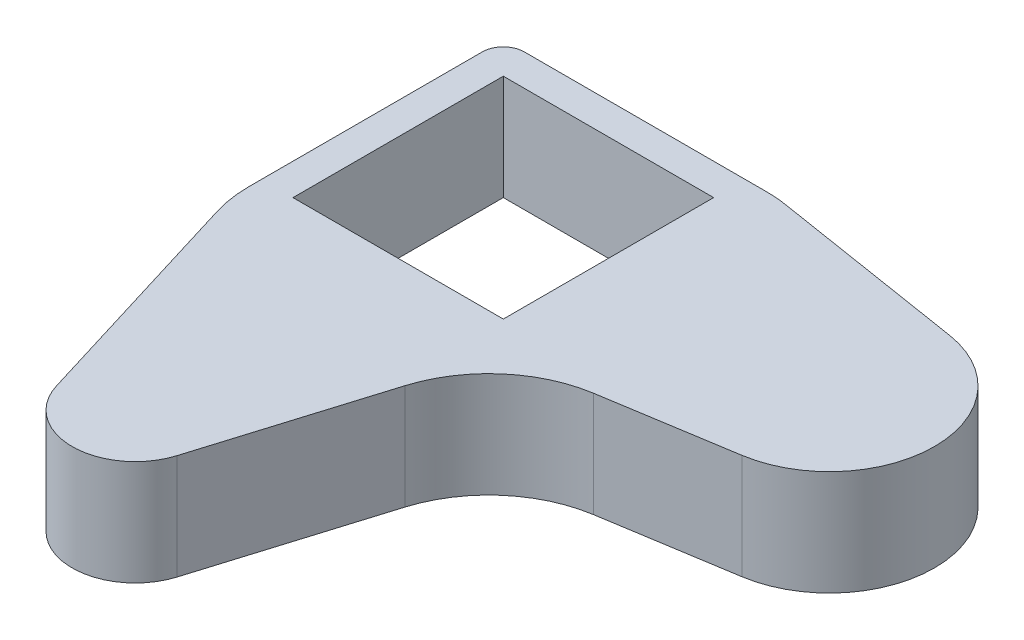
ISO-10303-21;
HEADER;
FILE_DESCRIPTION(('STEP AP214'),'2;1');
FILE_NAME('part.step','',(''),(''),'','','');
FILE_SCHEMA(('AUTOMOTIVE_DESIGN { 1 0 10303 214 1 1 1 1 }'));
ENDSEC;
DATA;
#1=APPLICATION_CONTEXT('core data for automotive mechanical design processes');
#2=APPLICATION_PROTOCOL_DEFINITION('international standard','automotive_design',2000,#1);
#3=PRODUCT_CONTEXT('',#1,'mechanical');
#4=PRODUCT('Part','Part','',(#3));
#5=PRODUCT_RELATED_PRODUCT_CATEGORY('part','',(#4));
#6=PRODUCT_DEFINITION_FORMATION('','',#4);
#7=PRODUCT_DEFINITION_CONTEXT('part definition',#1,'design');
#8=PRODUCT_DEFINITION('design','',#6,#7);
#9=PRODUCT_DEFINITION_SHAPE('','',#8);
#10=(LENGTH_UNIT() NAMED_UNIT(*) SI_UNIT(.MILLI.,.METRE.));
#11=(NAMED_UNIT(*) PLANE_ANGLE_UNIT() SI_UNIT($,.RADIAN.));
#12=(NAMED_UNIT(*) SI_UNIT($,.STERADIAN.) SOLID_ANGLE_UNIT());
#13=UNCERTAINTY_MEASURE_WITH_UNIT(LENGTH_MEASURE(1.E-05),#10,'distance_accuracy_value','');
#14=(GEOMETRIC_REPRESENTATION_CONTEXT(3) GLOBAL_UNCERTAINTY_ASSIGNED_CONTEXT((#13)) GLOBAL_UNIT_ASSIGNED_CONTEXT((#10,
#11,#12)) REPRESENTATION_CONTEXT('',''));
#15=CARTESIAN_POINT('',(0.,0.,0.));
#16=DIRECTION('',(0.,0.,1.));
#17=DIRECTION('',(1.,0.,0.));
#18=AXIS2_PLACEMENT_3D('',#15,#16,#17);
#19=CARTESIAN_POINT('',(-1.,10.,-1.));
#20=DIRECTION('',(0.,-1.,0.));
#21=DIRECTION('',(0.,0.,-1.));
#22=AXIS2_PLACEMENT_3D('',#19,#20,#21);
#23=PLANE('',#22);
#24=CARTESIAN_POINT('',(-1.,10.,-1.));
#25=DIRECTION('',(0.,1.,0.));
#26=DIRECTION('',(0.,0.,-1.));
#27=AXIS2_PLACEMENT_3D('',#24,#25,#26);
#28=CIRCLE('',#27,2.);
#29=CARTESIAN_POINT('',(-1.,10.,-3.));
#30=VERTEX_POINT('',#29);
#31=CARTESIAN_POINT('',(-3.,10.,-1.));
#32=VERTEX_POINT('',#31);
#33=EDGE_CURVE('E207',#30,#32,#28,.T.);
#34=ORIENTED_EDGE('',*,*,#33,.T.);
#35=DIRECTION('',(0.,0.,1.));
#36=VECTOR('',#35,1.);
#37=CARTESIAN_POINT('',(-3.,10.,21.2066412441588));
#38=LINE('',#37,#36);
#39=CARTESIAN_POINT('',(-3.,10.,21.2066412441588));
#40=VERTEX_POINT('',#39);
#41=EDGE_CURVE('E211',#32,#40,#38,.T.);
#42=ORIENTED_EDGE('',*,*,#41,.T.);
#43=CARTESIAN_POINT('',(9.,10.,21.2066412441589));
#44=DIRECTION('',(0.,1.,0.));
#45=DIRECTION('',(0.,0.,1.));
#46=AXIS2_PLACEMENT_3D('',#43,#44,#45);
#47=CIRCLE('',#46,12.);
#48=CARTESIAN_POINT('',(-2.47568753436689,10.,24.7150020599212));
#49=VERTEX_POINT('',#48);
#50=EDGE_CURVE('E215',#40,#49,#47,.T.);
#51=ORIENTED_EDGE('',*,*,#50,.T.);
#52=DIRECTION('',(0.292363401313522,0.,0.956307294530575));
#53=VECTOR('',#52,1.);
#54=CARTESIAN_POINT('',(-2.47568753436689,10.,24.7150020599212));
#55=LINE('',#54,#53);
#56=CARTESIAN_POINT('',(4.26215623281655,10.,46.7541804078811));
#57=VERTEX_POINT('',#56);
#58=EDGE_CURVE('E218',#49,#57,#55,.T.);
#59=ORIENTED_EDGE('',*,*,#58,.T.);
#60=CARTESIAN_POINT('',(10.,10.,45.));
#61=DIRECTION('',(0.,1.,0.));
#62=DIRECTION('',(0.,0.,1.));
#63=AXIS2_PLACEMENT_3D('',#60,#61,#62);
#64=CIRCLE('',#63,6.00000000000001);
#65=CARTESIAN_POINT('',(15.7378437671835,10.,46.7541804078811));
#66=VERTEX_POINT('',#65);
#67=EDGE_CURVE('E221',#57,#66,#64,.T.);
#68=ORIENTED_EDGE('',*,*,#67,.T.);
#69=DIRECTION('',(0.292363401313521,0.,-0.956307294530575));
#70=VECTOR('',#69,1.);
#71=CARTESIAN_POINT('',(20.8106801247672,10.,30.1611650341308));
#72=LINE('',#71,#70);
#73=CARTESIAN_POINT('',(20.8106801247672,10.,30.1611650341308));
#74=VERTEX_POINT('',#73);
#75=EDGE_CURVE('E224',#66,#74,#72,.T.);
#76=ORIENTED_EDGE('',*,*,#75,.T.);
#77=CARTESIAN_POINT('',(32.2863676591341,10.,33.669525849893));
#78=DIRECTION('',(0.,-1.,0.));
#79=DIRECTION('',(0.,0.,1.));
#80=AXIS2_PLACEMENT_3D('',#77,#78,#79);
#81=CIRCLE('',#80,12.);
#82=CARTESIAN_POINT('',(30.3947256594395,10.,21.819560004162));
#83=VERTEX_POINT('',#82);
#84=EDGE_CURVE('E227',#74,#83,#81,.T.);
#85=ORIENTED_EDGE('',*,*,#84,.T.);
#86=DIRECTION('',(0.987497153810917,0.,-0.157636833307885));
#87=VECTOR('',#86,1.);
#88=CARTESIAN_POINT('',(30.3947256594395,10.,21.819560004162));
#89=LINE('',#88,#87);
#90=CARTESIAN_POINT('',(42.5763683330788,10.,19.8749715381092));
#91=VERTEX_POINT('',#90);
#92=EDGE_CURVE('E230',#83,#91,#89,.T.);
#93=ORIENTED_EDGE('',*,*,#92,.T.);
#94=CARTESIAN_POINT('',(41.,10.,9.99999999999999));
#95=DIRECTION('',(0.,1.,0.));
#96=DIRECTION('',(0.,0.,1.));
#97=AXIS2_PLACEMENT_3D('',#94,#95,#96);
#98=CIRCLE('',#97,10.);
#99=CARTESIAN_POINT('',(42.5763683330788,10.,0.12502846189082));
#100=VERTEX_POINT('',#99);
#101=EDGE_CURVE('E233',#91,#100,#98,.T.);
#102=ORIENTED_EDGE('',*,*,#101,.T.);
#103=DIRECTION('',(-0.987497153810917,0.,-0.157636833307885));
#104=VECTOR('',#103,1.);
#105=CARTESIAN_POINT('',(23.9398710771213,10.,-2.849965845731));
#106=LINE('',#105,#104);
#107=CARTESIAN_POINT('',(23.9398710771213,10.,-2.849965845731));
#108=VERTEX_POINT('',#107);
#109=EDGE_CURVE('E236',#100,#108,#106,.T.);
#110=ORIENTED_EDGE('',*,*,#109,.T.);
#111=CARTESIAN_POINT('',(22.0482290774266,10.,9.));
#112=DIRECTION('',(0.,1.,0.));
#113=DIRECTION('',(0.,0.,1.));
#114=AXIS2_PLACEMENT_3D('',#111,#112,#113);
#115=CIRCLE('',#114,12.);
#116=CARTESIAN_POINT('',(22.0482290774266,10.,-3.));
#117=VERTEX_POINT('',#116);
#118=EDGE_CURVE('E239',#108,#117,#115,.T.);
#119=ORIENTED_EDGE('',*,*,#118,.T.);
#120=DIRECTION('',(-1.,0.,0.));
#121=VECTOR('',#120,1.);
#122=CARTESIAN_POINT('',(-1.,10.,-3.));
#123=LINE('',#122,#121);
#124=EDGE_CURVE('E242',#117,#30,#123,.T.);
#125=ORIENTED_EDGE('',*,*,#124,.T.);
#126=EDGE_LOOP('',(#34,#42,#51,#59,#68,#76,#85,#93,#102,#110,#119,#125));
#127=FACE_BOUND('',#126,.T.);
#128=DIRECTION('',(0.,0.,-1.));
#129=VECTOR('',#128,1.);
#130=CARTESIAN_POINT('',(20.,10.,20.));
#131=LINE('',#130,#129);
#132=CARTESIAN_POINT('',(20.,10.,20.));
#133=VERTEX_POINT('',#132);
#134=CARTESIAN_POINT('',(20.,10.,0.));
#135=VERTEX_POINT('',#134);
#136=EDGE_CURVE('E159',#133,#135,#131,.T.);
#137=ORIENTED_EDGE('',*,*,#136,.F.);
#138=DIRECTION('',(1.,0.,0.));
#139=VECTOR('',#138,1.);
#140=CARTESIAN_POINT('',(0.,10.,20.));
#141=LINE('',#140,#139);
#142=CARTESIAN_POINT('',(0.,10.,20.));
#143=VERTEX_POINT('',#142);
#144=EDGE_CURVE('E185',#143,#133,#141,.T.);
#145=ORIENTED_EDGE('',*,*,#144,.F.);
#146=DIRECTION('',(0.,0.,1.));
#147=VECTOR('',#146,1.);
#148=CARTESIAN_POINT('',(0.,10.,20.));
#149=LINE('',#148,#147);
#150=CARTESIAN_POINT('',(0.,10.,0.));
#151=VERTEX_POINT('',#150);
#152=EDGE_CURVE('E181',#151,#143,#149,.T.);
#153=ORIENTED_EDGE('',*,*,#152,.F.);
#154=DIRECTION('',(-1.,0.,0.));
#155=VECTOR('',#154,1.);
#156=CARTESIAN_POINT('',(0.,10.,0.));
#157=LINE('',#156,#155);
#158=EDGE_CURVE('E168',#135,#151,#157,.T.);
#159=ORIENTED_EDGE('',*,*,#158,.F.);
#160=EDGE_LOOP('',(#137,#145,#153,#159));
#161=FACE_BOUND('',#160,.T.);
#162=ADVANCED_FACE('F45',(#127,#161),#23,.F.);
#163=CARTESIAN_POINT('',(-1.,0.,-1.));
#164=DIRECTION('',(0.,-1.,0.));
#165=DIRECTION('',(0.,0.,-1.));
#166=AXIS2_PLACEMENT_3D('',#163,#164,#165);
#167=PLANE('',#166);
#168=CARTESIAN_POINT('',(-1.,0.,-1.));
#169=DIRECTION('',(0.,1.,0.));
#170=DIRECTION('',(0.,0.,-1.));
#171=AXIS2_PLACEMENT_3D('',#168,#169,#170);
#172=CIRCLE('',#171,2.);
#173=CARTESIAN_POINT('',(-1.,0.,-3.));
#174=VERTEX_POINT('',#173);
#175=CARTESIAN_POINT('',(-3.,0.,-1.));
#176=VERTEX_POINT('',#175);
#177=EDGE_CURVE('E177',#174,#176,#172,.T.);
#178=ORIENTED_EDGE('',*,*,#177,.F.);
#179=DIRECTION('',(-1.,0.,0.));
#180=VECTOR('',#179,1.);
#181=CARTESIAN_POINT('',(-1.,0.,-3.));
#182=LINE('',#181,#180);
#183=CARTESIAN_POINT('',(22.0482290774266,0.,-3.));
#184=VERTEX_POINT('',#183);
#185=EDGE_CURVE('E212',#184,#174,#182,.T.);
#186=ORIENTED_EDGE('',*,*,#185,.F.);
#187=CARTESIAN_POINT('',(22.0482290774266,0.,9.));
#188=DIRECTION('',(0.,1.,0.));
#189=DIRECTION('',(0.,0.,1.));
#190=AXIS2_PLACEMENT_3D('',#187,#188,#189);
#191=CIRCLE('',#190,12.);
#192=CARTESIAN_POINT('',(23.9398710771213,0.,-2.849965845731));
#193=VERTEX_POINT('',#192);
#194=EDGE_CURVE('E276',#193,#184,#191,.T.);
#195=ORIENTED_EDGE('',*,*,#194,.F.);
#196=DIRECTION('',(-0.987497153810917,0.,-0.157636833307885));
#197=VECTOR('',#196,1.);
#198=CARTESIAN_POINT('',(23.9398710771213,0.,-2.849965845731));
#199=LINE('',#198,#197);
#200=CARTESIAN_POINT('',(42.5763683330788,0.,0.12502846189082));
#201=VERTEX_POINT('',#200);
#202=EDGE_CURVE('E273',#201,#193,#199,.T.);
#203=ORIENTED_EDGE('',*,*,#202,.F.);
#204=CARTESIAN_POINT('',(41.,0.,9.99999999999999));
#205=DIRECTION('',(0.,1.,0.));
#206=DIRECTION('',(0.,0.,1.));
#207=AXIS2_PLACEMENT_3D('',#204,#205,#206);
#208=CIRCLE('',#207,10.);
#209=CARTESIAN_POINT('',(42.5763683330788,0.,19.8749715381092));
#210=VERTEX_POINT('',#209);
#211=EDGE_CURVE('E270',#210,#201,#208,.T.);
#212=ORIENTED_EDGE('',*,*,#211,.F.);
#213=DIRECTION('',(0.987497153810917,0.,-0.157636833307885));
#214=VECTOR('',#213,1.);
#215=CARTESIAN_POINT('',(30.3947256594395,0.,21.819560004162));
#216=LINE('',#215,#214);
#217=CARTESIAN_POINT('',(30.3947256594395,0.,21.819560004162));
#218=VERTEX_POINT('',#217);
#219=EDGE_CURVE('E267',#218,#210,#216,.T.);
#220=ORIENTED_EDGE('',*,*,#219,.F.);
#221=CARTESIAN_POINT('',(32.2863676591341,0.,33.669525849893));
#222=DIRECTION('',(0.,-1.,0.));
#223=DIRECTION('',(0.,0.,1.));
#224=AXIS2_PLACEMENT_3D('',#221,#222,#223);
#225=CIRCLE('',#224,12.);
#226=CARTESIAN_POINT('',(20.8106801247672,0.,30.1611650341308));
#227=VERTEX_POINT('',#226);
#228=EDGE_CURVE('E264',#227,#218,#225,.T.);
#229=ORIENTED_EDGE('',*,*,#228,.F.);
#230=DIRECTION('',(0.292363401313521,0.,-0.956307294530575));
#231=VECTOR('',#230,1.);
#232=CARTESIAN_POINT('',(20.8106801247672,0.,30.1611650341308));
#233=LINE('',#232,#231);
#234=CARTESIAN_POINT('',(15.7378437671835,0.,46.7541804078811));
#235=VERTEX_POINT('',#234);
#236=EDGE_CURVE('E261',#235,#227,#233,.T.);
#237=ORIENTED_EDGE('',*,*,#236,.F.);
#238=CARTESIAN_POINT('',(10.,0.,45.));
#239=DIRECTION('',(0.,1.,0.));
#240=DIRECTION('',(0.,0.,1.));
#241=AXIS2_PLACEMENT_3D('',#238,#239,#240);
#242=CIRCLE('',#241,6.00000000000001);
#243=CARTESIAN_POINT('',(4.26215623281655,0.,46.7541804078811));
#244=VERTEX_POINT('',#243);
#245=EDGE_CURVE('E258',#244,#235,#242,.T.);
#246=ORIENTED_EDGE('',*,*,#245,.F.);
#247=DIRECTION('',(0.292363401313522,0.,0.956307294530575));
#248=VECTOR('',#247,1.);
#249=CARTESIAN_POINT('',(-2.47568753436689,0.,24.7150020599212));
#250=LINE('',#249,#248);
#251=CARTESIAN_POINT('',(-2.47568753436689,0.,24.7150020599212));
#252=VERTEX_POINT('',#251);
#253=EDGE_CURVE('E255',#252,#244,#250,.T.);
#254=ORIENTED_EDGE('',*,*,#253,.F.);
#255=CARTESIAN_POINT('',(9.,0.,21.2066412441589));
#256=DIRECTION('',(0.,1.,0.));
#257=DIRECTION('',(0.,0.,1.));
#258=AXIS2_PLACEMENT_3D('',#255,#256,#257);
#259=CIRCLE('',#258,12.);
#260=CARTESIAN_POINT('',(-3.,0.,21.2066412441588));
#261=VERTEX_POINT('',#260);
#262=EDGE_CURVE('E252',#261,#252,#259,.T.);
#263=ORIENTED_EDGE('',*,*,#262,.F.);
#264=DIRECTION('',(0.,0.,1.));
#265=VECTOR('',#264,1.);
#266=CARTESIAN_POINT('',(-3.,0.,21.2066412441588));
#267=LINE('',#266,#265);
#268=EDGE_CURVE('E249',#176,#261,#267,.T.);
#269=ORIENTED_EDGE('',*,*,#268,.F.);
#270=EDGE_LOOP('',(#178,#186,#195,#203,#212,#220,#229,#237,#246,#254,#263,#269));
#271=FACE_BOUND('',#270,.T.);
#272=DIRECTION('',(1.,0.,0.));
#273=VECTOR('',#272,1.);
#274=CARTESIAN_POINT('',(0.,0.,20.));
#275=LINE('',#274,#273);
#276=CARTESIAN_POINT('',(0.,0.,20.));
#277=VERTEX_POINT('',#276);
#278=CARTESIAN_POINT('',(20.,0.,20.));
#279=VERTEX_POINT('',#278);
#280=EDGE_CURVE('E169',#277,#279,#275,.T.);
#281=ORIENTED_EDGE('',*,*,#280,.T.);
#282=DIRECTION('',(0.,0.,-1.));
#283=VECTOR('',#282,1.);
#284=CARTESIAN_POINT('',(20.,0.,20.));
#285=LINE('',#284,#283);
#286=CARTESIAN_POINT('',(20.,0.,0.));
#287=VERTEX_POINT('',#286);
#288=EDGE_CURVE('E69',#279,#287,#285,.T.);
#289=ORIENTED_EDGE('',*,*,#288,.T.);
#290=DIRECTION('',(-1.,0.,0.));
#291=VECTOR('',#290,1.);
#292=CARTESIAN_POINT('',(0.,0.,0.));
#293=LINE('',#292,#291);
#294=CARTESIAN_POINT('',(0.,0.,0.));
#295=VERTEX_POINT('',#294);
#296=EDGE_CURVE('E175',#287,#295,#293,.T.);
#297=ORIENTED_EDGE('',*,*,#296,.T.);
#298=DIRECTION('',(0.,0.,1.));
#299=VECTOR('',#298,1.);
#300=CARTESIAN_POINT('',(0.,0.,20.));
#301=LINE('',#300,#299);
#302=EDGE_CURVE('E194',#295,#277,#301,.T.);
#303=ORIENTED_EDGE('',*,*,#302,.T.);
#304=EDGE_LOOP('',(#281,#289,#297,#303));
#305=FACE_BOUND('',#304,.T.);
#306=ADVANCED_FACE('F331',(#271,#305),#167,.T.);
#307=CARTESIAN_POINT('',(-1.,10.,-1.));
#308=DIRECTION('',(0.,-1.,0.));
#309=DIRECTION('',(0.,0.,-1.));
#310=AXIS2_PLACEMENT_3D('',#307,#308,#309);
#311=CYLINDRICAL_SURFACE('',#310,2.);
#312=ORIENTED_EDGE('',*,*,#177,.T.);
#313=DIRECTION('',(0.,-1.,0.));
#314=VECTOR('',#313,1.);
#315=CARTESIAN_POINT('',(-3.,10.,-1.));
#316=LINE('',#315,#314);
#317=EDGE_CURVE('E11',#32,#176,#316,.T.);
#318=ORIENTED_EDGE('',*,*,#317,.F.);
#319=ORIENTED_EDGE('',*,*,#33,.F.);
#320=DIRECTION('',(0.,-1.,0.));
#321=VECTOR('',#320,1.);
#322=CARTESIAN_POINT('',(-1.,10.,-3.));
#323=LINE('',#322,#321);
#324=EDGE_CURVE('E245',#30,#174,#323,.T.);
#325=ORIENTED_EDGE('',*,*,#324,.T.);
#326=EDGE_LOOP('',(#312,#318,#319,#325));
#327=FACE_BOUND('',#326,.T.);
#328=ADVANCED_FACE('F47',(#327),#311,.T.);
#329=CARTESIAN_POINT('',(-3.,10.,21.2066412441588));
#330=DIRECTION('',(1.,0.,0.));
#331=DIRECTION('',(0.,0.,-1.));
#332=AXIS2_PLACEMENT_3D('',#329,#330,#331);
#333=PLANE('',#332);
#334=ORIENTED_EDGE('',*,*,#268,.T.);
#335=DIRECTION('',(0.,-1.,0.));
#336=VECTOR('',#335,1.);
#337=CARTESIAN_POINT('',(-3.,10.,21.2066412441588));
#338=LINE('',#337,#336);
#339=EDGE_CURVE('E54',#40,#261,#338,.T.);
#340=ORIENTED_EDGE('',*,*,#339,.F.);
#341=ORIENTED_EDGE('',*,*,#41,.F.);
#342=ORIENTED_EDGE('',*,*,#317,.T.);
#343=EDGE_LOOP('',(#334,#340,#341,#342));
#344=FACE_BOUND('',#343,.T.);
#345=ADVANCED_FACE('F348',(#344),#333,.F.);
#346=CARTESIAN_POINT('',(9.,10.,21.2066412441589));
#347=DIRECTION('',(0.,-1.,0.));
#348=DIRECTION('',(0.,0.,-1.));
#349=AXIS2_PLACEMENT_3D('',#346,#347,#348);
#350=CYLINDRICAL_SURFACE('',#349,12.);
#351=ORIENTED_EDGE('',*,*,#262,.T.);
#352=DIRECTION('',(0.,-1.,0.));
#353=VECTOR('',#352,1.);
#354=CARTESIAN_POINT('',(-2.47568753436689,10.,24.7150020599212));
#355=LINE('',#354,#353);
#356=EDGE_CURVE('E316',#49,#252,#355,.T.);
#357=ORIENTED_EDGE('',*,*,#356,.F.);
#358=ORIENTED_EDGE('',*,*,#50,.F.);
#359=ORIENTED_EDGE('',*,*,#339,.T.);
#360=EDGE_LOOP('',(#351,#357,#358,#359));
#361=FACE_BOUND('',#360,.T.);
#362=ADVANCED_FACE('F325',(#361),#350,.T.);
#363=CARTESIAN_POINT('',(-2.47568753436689,10.,24.7150020599212));
#364=DIRECTION('',(0.956307294530575,0.,-0.292363401313522));
#365=DIRECTION('',(-0.292363401313522,0.,-0.956307294530576));
#366=AXIS2_PLACEMENT_3D('',#363,#364,#365);
#367=PLANE('',#366);
#368=ORIENTED_EDGE('',*,*,#253,.T.);
#369=DIRECTION('',(0.,-1.,0.));
#370=VECTOR('',#369,1.);
#371=CARTESIAN_POINT('',(4.26215623281655,10.,46.7541804078811));
#372=LINE('',#371,#370);
#373=EDGE_CURVE('E312',#57,#244,#372,.T.);
#374=ORIENTED_EDGE('',*,*,#373,.F.);
#375=ORIENTED_EDGE('',*,*,#58,.F.);
#376=ORIENTED_EDGE('',*,*,#356,.T.);
#377=EDGE_LOOP('',(#368,#374,#375,#376));
#378=FACE_BOUND('',#377,.T.);
#379=ADVANCED_FACE('F337',(#378),#367,.F.);
#380=CARTESIAN_POINT('',(10.,10.,45.));
#381=DIRECTION('',(0.,-1.,0.));
#382=DIRECTION('',(0.,0.,-1.));
#383=AXIS2_PLACEMENT_3D('',#380,#381,#382);
#384=CYLINDRICAL_SURFACE('',#383,6.00000000000001);
#385=ORIENTED_EDGE('',*,*,#245,.T.);
#386=DIRECTION('',(0.,-1.,0.));
#387=VECTOR('',#386,1.);
#388=CARTESIAN_POINT('',(15.7378437671835,10.,46.7541804078811));
#389=LINE('',#388,#387);
#390=EDGE_CURVE('E308',#66,#235,#389,.T.);
#391=ORIENTED_EDGE('',*,*,#390,.F.);
#392=ORIENTED_EDGE('',*,*,#67,.F.);
#393=ORIENTED_EDGE('',*,*,#373,.T.);
#394=EDGE_LOOP('',(#385,#391,#392,#393));
#395=FACE_BOUND('',#394,.T.);
#396=ADVANCED_FACE('F341',(#395),#384,.T.);
#397=CARTESIAN_POINT('',(20.8106801247672,10.,30.1611650341308));
#398=DIRECTION('',(-0.956307294530575,0.,-0.292363401313521));
#399=DIRECTION('',(-0.292363401313521,0.,0.956307294530576));
#400=AXIS2_PLACEMENT_3D('',#397,#398,#399);
#401=PLANE('',#400);
#402=ORIENTED_EDGE('',*,*,#236,.T.);
#403=DIRECTION('',(0.,-1.,0.));
#404=VECTOR('',#403,1.);
#405=CARTESIAN_POINT('',(20.8106801247672,10.,30.1611650341308));
#406=LINE('',#405,#404);
#407=EDGE_CURVE('E304',#74,#227,#406,.T.);
#408=ORIENTED_EDGE('',*,*,#407,.F.);
#409=ORIENTED_EDGE('',*,*,#75,.F.);
#410=ORIENTED_EDGE('',*,*,#390,.T.);
#411=EDGE_LOOP('',(#402,#408,#409,#410));
#412=FACE_BOUND('',#411,.T.);
#413=ADVANCED_FACE('F381',(#412),#401,.F.);
#414=CARTESIAN_POINT('',(32.2863676591341,10.,33.669525849893));
#415=DIRECTION('',(0.,-1.,0.));
#416=DIRECTION('',(0.,0.,-1.));
#417=AXIS2_PLACEMENT_3D('',#414,#415,#416);
#418=CYLINDRICAL_SURFACE('',#417,12.);
#419=ORIENTED_EDGE('',*,*,#228,.T.);
#420=DIRECTION('',(0.,-1.,0.));
#421=VECTOR('',#420,1.);
#422=CARTESIAN_POINT('',(30.3947256594395,10.,21.819560004162));
#423=LINE('',#422,#421);
#424=EDGE_CURVE('E300',#83,#218,#423,.T.);
#425=ORIENTED_EDGE('',*,*,#424,.F.);
#426=ORIENTED_EDGE('',*,*,#84,.F.);
#427=ORIENTED_EDGE('',*,*,#407,.T.);
#428=EDGE_LOOP('',(#419,#425,#426,#427));
#429=FACE_BOUND('',#428,.T.);
#430=ADVANCED_FACE('F379',(#429),#418,.F.);
#431=CARTESIAN_POINT('',(30.3947256594395,10.,21.819560004162));
#432=DIRECTION('',(-0.157636833307885,0.,-0.987497153810917));
#433=DIRECTION('',(-0.987497153810917,0.,0.157636833307885));
#434=AXIS2_PLACEMENT_3D('',#431,#432,#433);
#435=PLANE('',#434);
#436=ORIENTED_EDGE('',*,*,#219,.T.);
#437=DIRECTION('',(0.,-1.,0.));
#438=VECTOR('',#437,1.);
#439=CARTESIAN_POINT('',(42.5763683330788,10.,19.8749715381092));
#440=LINE('',#439,#438);
#441=EDGE_CURVE('E296',#91,#210,#440,.T.);
#442=ORIENTED_EDGE('',*,*,#441,.F.);
#443=ORIENTED_EDGE('',*,*,#92,.F.);
#444=ORIENTED_EDGE('',*,*,#424,.T.);
#445=EDGE_LOOP('',(#436,#442,#443,#444));
#446=FACE_BOUND('',#445,.T.);
#447=ADVANCED_FACE('F375',(#446),#435,.F.);
#448=CARTESIAN_POINT('',(41.,10.,9.99999999999999));
#449=DIRECTION('',(0.,-1.,0.));
#450=DIRECTION('',(0.,0.,-1.));
#451=AXIS2_PLACEMENT_3D('',#448,#449,#450);
#452=CYLINDRICAL_SURFACE('',#451,10.);
#453=ORIENTED_EDGE('',*,*,#211,.T.);
#454=DIRECTION('',(0.,-1.,0.));
#455=VECTOR('',#454,1.);
#456=CARTESIAN_POINT('',(42.5763683330788,10.,0.12502846189082));
#457=LINE('',#456,#455);
#458=EDGE_CURVE('E292',#100,#201,#457,.T.);
#459=ORIENTED_EDGE('',*,*,#458,.F.);
#460=ORIENTED_EDGE('',*,*,#101,.F.);
#461=ORIENTED_EDGE('',*,*,#441,.T.);
#462=EDGE_LOOP('',(#453,#459,#460,#461));
#463=FACE_BOUND('',#462,.T.);
#464=ADVANCED_FACE('F370',(#463),#452,.T.);
#465=CARTESIAN_POINT('',(23.9398710771213,10.,-2.849965845731));
#466=DIRECTION('',(-0.157636833307885,0.,0.987497153810917));
#467=DIRECTION('',(0.987497153810917,0.,0.157636833307885));
#468=AXIS2_PLACEMENT_3D('',#465,#466,#467);
#469=PLANE('',#468);
#470=ORIENTED_EDGE('',*,*,#202,.T.);
#471=DIRECTION('',(0.,-1.,0.));
#472=VECTOR('',#471,1.);
#473=CARTESIAN_POINT('',(23.9398710771213,10.,-2.849965845731));
#474=LINE('',#473,#472);
#475=EDGE_CURVE('E288',#108,#193,#474,.T.);
#476=ORIENTED_EDGE('',*,*,#475,.F.);
#477=ORIENTED_EDGE('',*,*,#109,.F.);
#478=ORIENTED_EDGE('',*,*,#458,.T.);
#479=EDGE_LOOP('',(#470,#476,#477,#478));
#480=FACE_BOUND('',#479,.T.);
#481=ADVANCED_FACE('F364',(#480),#469,.F.);
#482=CARTESIAN_POINT('',(22.0482290774266,10.,9.));
#483=DIRECTION('',(0.,-1.,0.));
#484=DIRECTION('',(0.,0.,-1.));
#485=AXIS2_PLACEMENT_3D('',#482,#483,#484);
#486=CYLINDRICAL_SURFACE('',#485,12.);
#487=ORIENTED_EDGE('',*,*,#194,.T.);
#488=DIRECTION('',(0.,-1.,0.));
#489=VECTOR('',#488,1.);
#490=CARTESIAN_POINT('',(22.0482290774266,10.,-3.));
#491=LINE('',#490,#489);
#492=EDGE_CURVE('E284',#117,#184,#491,.T.);
#493=ORIENTED_EDGE('',*,*,#492,.F.);
#494=ORIENTED_EDGE('',*,*,#118,.F.);
#495=ORIENTED_EDGE('',*,*,#475,.T.);
#496=EDGE_LOOP('',(#487,#493,#494,#495));
#497=FACE_BOUND('',#496,.T.);
#498=ADVANCED_FACE('F360',(#497),#486,.T.);
#499=CARTESIAN_POINT('',(-1.,10.,-3.));
#500=DIRECTION('',(0.,0.,1.));
#501=DIRECTION('',(1.,0.,0.));
#502=AXIS2_PLACEMENT_3D('',#499,#500,#501);
#503=PLANE('',#502);
#504=ORIENTED_EDGE('',*,*,#185,.T.);
#505=ORIENTED_EDGE('',*,*,#324,.F.);
#506=ORIENTED_EDGE('',*,*,#124,.F.);
#507=ORIENTED_EDGE('',*,*,#492,.T.);
#508=EDGE_LOOP('',(#504,#505,#506,#507));
#509=FACE_BOUND('',#508,.T.);
#510=ADVANCED_FACE('F355',(#509),#503,.F.);
#511=CARTESIAN_POINT('',(20.,10.,20.));
#512=DIRECTION('',(-1.,0.,0.));
#513=DIRECTION('',(0.,0.,1.));
#514=AXIS2_PLACEMENT_3D('',#511,#512,#513);
#515=PLANE('',#514);
#516=ORIENTED_EDGE('',*,*,#288,.F.);
#517=DIRECTION('',(0.,-1.,0.));
#518=VECTOR('',#517,1.);
#519=CARTESIAN_POINT('',(20.,10.,20.));
#520=LINE('',#519,#518);
#521=EDGE_CURVE('E163',#133,#279,#520,.T.);
#522=ORIENTED_EDGE('',*,*,#521,.F.);
#523=ORIENTED_EDGE('',*,*,#136,.T.);
#524=DIRECTION('',(0.,-1.,0.));
#525=VECTOR('',#524,1.);
#526=CARTESIAN_POINT('',(20.,10.,0.));
#527=LINE('',#526,#525);
#528=EDGE_CURVE('E162',#135,#287,#527,.T.);
#529=ORIENTED_EDGE('',*,*,#528,.T.);
#530=EDGE_LOOP('',(#516,#522,#523,#529));
#531=FACE_BOUND('',#530,.T.);
#532=ADVANCED_FACE('F161',(#531),#515,.T.);
#533=CARTESIAN_POINT('',(0.,10.,0.));
#534=DIRECTION('',(0.,0.,1.));
#535=DIRECTION('',(1.,0.,0.));
#536=AXIS2_PLACEMENT_3D('',#533,#534,#535);
#537=PLANE('',#536);
#538=ORIENTED_EDGE('',*,*,#296,.F.);
#539=ORIENTED_EDGE('',*,*,#528,.F.);
#540=ORIENTED_EDGE('',*,*,#158,.T.);
#541=DIRECTION('',(0.,-1.,0.));
#542=VECTOR('',#541,1.);
#543=CARTESIAN_POINT('',(0.,10.,0.));
#544=LINE('',#543,#542);
#545=EDGE_CURVE('E178',#151,#295,#544,.T.);
#546=ORIENTED_EDGE('',*,*,#545,.T.);
#547=EDGE_LOOP('',(#538,#539,#540,#546));
#548=FACE_BOUND('',#547,.T.);
#549=ADVANCED_FACE('F172',(#548),#537,.T.);
#550=CARTESIAN_POINT('',(0.,10.,20.));
#551=DIRECTION('',(1.,0.,0.));
#552=DIRECTION('',(0.,0.,-1.));
#553=AXIS2_PLACEMENT_3D('',#550,#551,#552);
#554=PLANE('',#553);
#555=ORIENTED_EDGE('',*,*,#302,.F.);
#556=ORIENTED_EDGE('',*,*,#545,.F.);
#557=ORIENTED_EDGE('',*,*,#152,.T.);
#558=DIRECTION('',(0.,-1.,0.));
#559=VECTOR('',#558,1.);
#560=CARTESIAN_POINT('',(0.,10.,20.));
#561=LINE('',#560,#559);
#562=EDGE_CURVE('E61',#143,#277,#561,.T.);
#563=ORIENTED_EDGE('',*,*,#562,.T.);
#564=EDGE_LOOP('',(#555,#556,#557,#563));
#565=FACE_BOUND('',#564,.T.);
#566=ADVANCED_FACE('F445',(#565),#554,.T.);
#567=CARTESIAN_POINT('',(0.,10.,20.));
#568=DIRECTION('',(0.,0.,-1.));
#569=DIRECTION('',(-1.,0.,0.));
#570=AXIS2_PLACEMENT_3D('',#567,#568,#569);
#571=PLANE('',#570);
#572=ORIENTED_EDGE('',*,*,#280,.F.);
#573=ORIENTED_EDGE('',*,*,#562,.F.);
#574=ORIENTED_EDGE('',*,*,#144,.T.);
#575=ORIENTED_EDGE('',*,*,#521,.T.);
#576=EDGE_LOOP('',(#572,#573,#574,#575));
#577=FACE_BOUND('',#576,.T.);
#578=ADVANCED_FACE('F452',(#577),#571,.T.);
#579=CLOSED_SHELL('',(#162,#306,#328,#345,#362,#379,#396,#413,#430,#447,#464,#481,#498,#510,
#532,#549,#566,#578));
#580=MANIFOLD_SOLID_BREP('B2',#579);
#581=ADVANCED_BREP_SHAPE_REPRESENTATION('',(#18,#580),#14);
#582=SHAPE_DEFINITION_REPRESENTATION(#9,#581);
ENDSEC;
END-ISO-10303-21;
